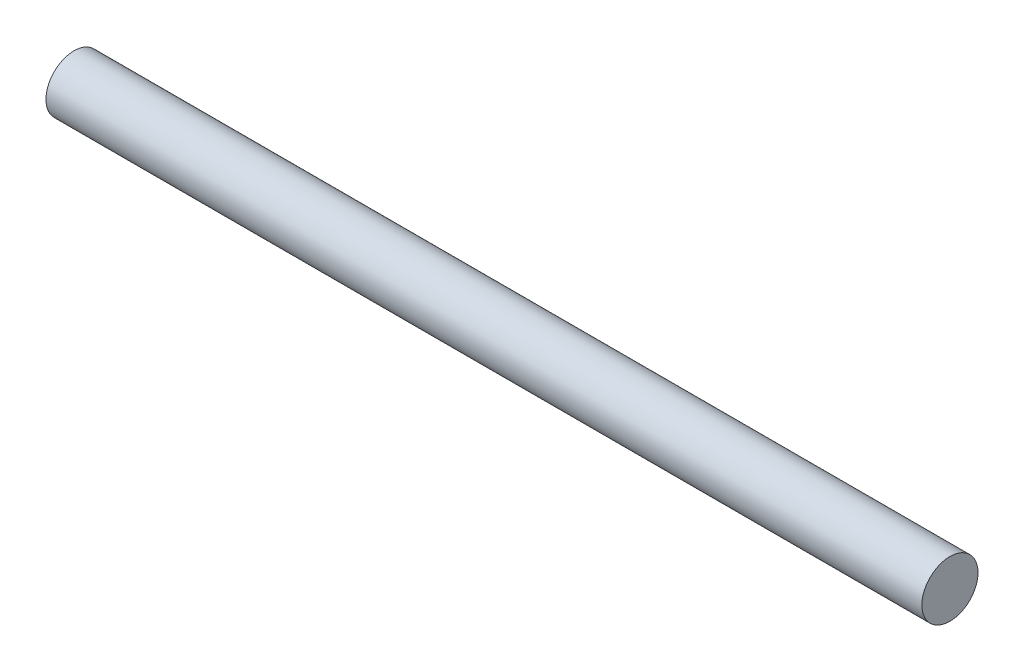
ISO-10303-21;
HEADER;
FILE_DESCRIPTION(('STEP AP214'),'2;1');
FILE_NAME('part.step','',(''),(''),'','','');
FILE_SCHEMA(('AUTOMOTIVE_DESIGN { 1 0 10303 214 1 1 1 1 }'));
ENDSEC;
DATA;
#1=APPLICATION_CONTEXT('core data for automotive mechanical design processes');
#2=APPLICATION_PROTOCOL_DEFINITION('international standard','automotive_design',2000,#1);
#3=PRODUCT_CONTEXT('',#1,'mechanical');
#4=PRODUCT('Part','Part','',(#3));
#5=PRODUCT_RELATED_PRODUCT_CATEGORY('part','',(#4));
#6=PRODUCT_DEFINITION_FORMATION('','',#4);
#7=PRODUCT_DEFINITION_CONTEXT('part definition',#1,'design');
#8=PRODUCT_DEFINITION('design','',#6,#7);
#9=PRODUCT_DEFINITION_SHAPE('','',#8);
#10=(LENGTH_UNIT() NAMED_UNIT(*) SI_UNIT(.MILLI.,.METRE.));
#11=(NAMED_UNIT(*) PLANE_ANGLE_UNIT() SI_UNIT($,.RADIAN.));
#12=(NAMED_UNIT(*) SI_UNIT($,.STERADIAN.) SOLID_ANGLE_UNIT());
#13=UNCERTAINTY_MEASURE_WITH_UNIT(LENGTH_MEASURE(1.E-05),#10,'distance_accuracy_value','');
#14=(GEOMETRIC_REPRESENTATION_CONTEXT(3) GLOBAL_UNCERTAINTY_ASSIGNED_CONTEXT((#13)) GLOBAL_UNIT_ASSIGNED_CONTEXT((#10,
#11,#12)) REPRESENTATION_CONTEXT('',''));
#15=CARTESIAN_POINT('',(0.,0.,0.));
#16=DIRECTION('',(0.,0.,1.));
#17=DIRECTION('',(1.,0.,0.));
#18=AXIS2_PLACEMENT_3D('',#15,#16,#17);
#19=CARTESIAN_POINT('',(198.12,0.,0.));
#20=DIRECTION('',(-1.,0.,0.));
#21=DIRECTION('',(0.,0.,1.));
#22=AXIS2_PLACEMENT_3D('',#19,#20,#21);
#23=CYLINDRICAL_SURFACE('',#22,6.35);
#24=CARTESIAN_POINT('',(198.12,0.,0.));
#25=DIRECTION('',(1.,0.,0.));
#26=DIRECTION('',(0.,0.,-1.));
#27=AXIS2_PLACEMENT_3D('',#24,#25,#26);
#28=CIRCLE('',#27,6.35);
#29=CARTESIAN_POINT('',(198.12,0.,-6.35));
#30=VERTEX_POINT('',#29);
#31=EDGE_CURVE('E10',#30,#30,#28,.T.);
#32=ORIENTED_EDGE('',*,*,#31,.F.);
#33=EDGE_LOOP('',(#32));
#34=FACE_BOUND('',#33,.T.);
#35=CARTESIAN_POINT('',(0.,0.,0.));
#36=DIRECTION('',(1.,0.,0.));
#37=DIRECTION('',(0.,0.,-1.));
#38=AXIS2_PLACEMENT_3D('',#35,#36,#37);
#39=CIRCLE('',#38,6.35);
#40=CARTESIAN_POINT('',(0.,0.,-6.35));
#41=VERTEX_POINT('',#40);
#42=EDGE_CURVE('E33',#41,#41,#39,.T.);
#43=ORIENTED_EDGE('',*,*,#42,.T.);
#44=EDGE_LOOP('',(#43));
#45=FACE_BOUND('',#44,.T.);
#46=ADVANCED_FACE('F30',(#34,#45),#23,.T.);
#47=CARTESIAN_POINT('',(198.12,0.,0.));
#48=DIRECTION('',(1.,0.,0.));
#49=DIRECTION('',(0.,0.,-1.));
#50=AXIS2_PLACEMENT_3D('',#47,#48,#49);
#51=PLANE('',#50);
#52=ORIENTED_EDGE('',*,*,#31,.T.);
#53=EDGE_LOOP('',(#52));
#54=FACE_BOUND('',#53,.T.);
#55=ADVANCED_FACE('F45',(#54),#51,.T.);
#56=CARTESIAN_POINT('',(0.,0.,0.));
#57=DIRECTION('',(1.,0.,0.));
#58=DIRECTION('',(0.,0.,-1.));
#59=AXIS2_PLACEMENT_3D('',#56,#57,#58);
#60=PLANE('',#59);
#61=ORIENTED_EDGE('',*,*,#42,.F.);
#62=EDGE_LOOP('',(#61));
#63=FACE_BOUND('',#62,.T.);
#64=ADVANCED_FACE('F43',(#63),#60,.F.);
#65=CLOSED_SHELL('',(#46,#55,#64));
#66=MANIFOLD_SOLID_BREP('B2',#65);
#67=ADVANCED_BREP_SHAPE_REPRESENTATION('',(#18,#66),#14);
#68=SHAPE_DEFINITION_REPRESENTATION(#9,#67);
ENDSEC;
END-ISO-10303-21;
